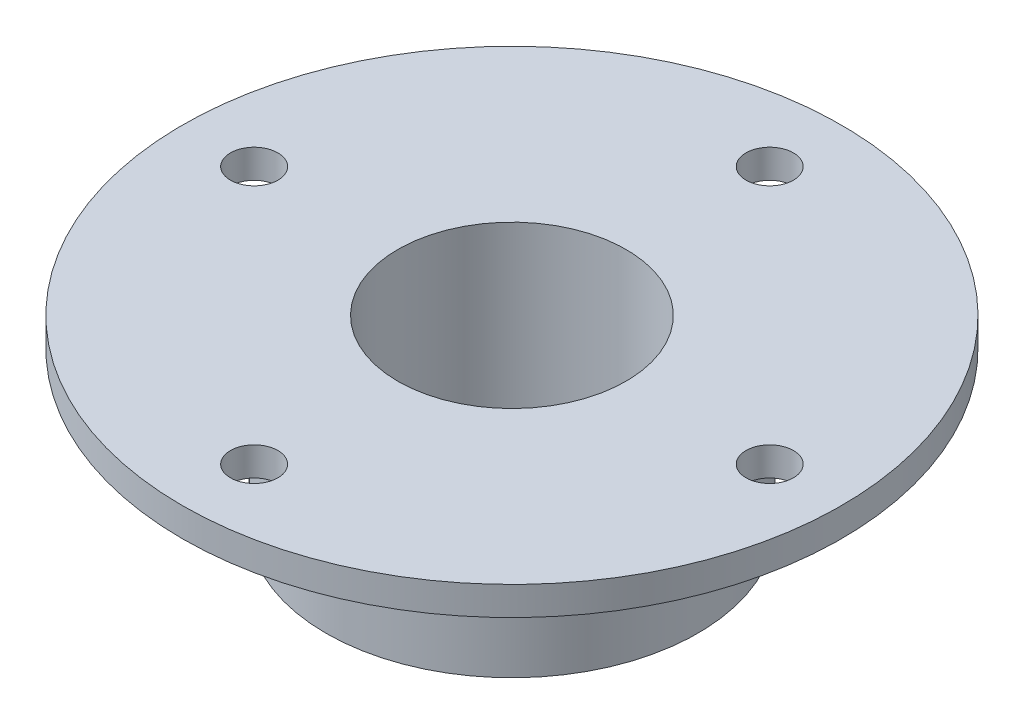
ISO-10303-21;
HEADER;
FILE_DESCRIPTION(('STEP AP214'),'2;1');
FILE_NAME('part.step','',(''),(''),'','','');
FILE_SCHEMA(('AUTOMOTIVE_DESIGN { 1 0 10303 214 1 1 1 1 }'));
ENDSEC;
DATA;
#1=APPLICATION_CONTEXT('core data for automotive mechanical design processes');
#2=APPLICATION_PROTOCOL_DEFINITION('international standard','automotive_design',2000,#1);
#3=PRODUCT_CONTEXT('',#1,'mechanical');
#4=PRODUCT('Part','Part','',(#3));
#5=PRODUCT_RELATED_PRODUCT_CATEGORY('part','',(#4));
#6=PRODUCT_DEFINITION_FORMATION('','',#4);
#7=PRODUCT_DEFINITION_CONTEXT('part definition',#1,'design');
#8=PRODUCT_DEFINITION('design','',#6,#7);
#9=PRODUCT_DEFINITION_SHAPE('','',#8);
#10=(LENGTH_UNIT() NAMED_UNIT(*) SI_UNIT(.MILLI.,.METRE.));
#11=(NAMED_UNIT(*) PLANE_ANGLE_UNIT() SI_UNIT($,.RADIAN.));
#12=(NAMED_UNIT(*) SI_UNIT($,.STERADIAN.) SOLID_ANGLE_UNIT());
#13=UNCERTAINTY_MEASURE_WITH_UNIT(LENGTH_MEASURE(1.E-05),#10,'distance_accuracy_value','');
#14=(GEOMETRIC_REPRESENTATION_CONTEXT(3) GLOBAL_UNCERTAINTY_ASSIGNED_CONTEXT((#13)) GLOBAL_UNIT_ASSIGNED_CONTEXT((#10,
#11,#12)) REPRESENTATION_CONTEXT('',''));
#15=CARTESIAN_POINT('',(0.,0.,0.));
#16=DIRECTION('',(0.,0.,1.));
#17=DIRECTION('',(1.,0.,0.));
#18=AXIS2_PLACEMENT_3D('',#15,#16,#17);
#19=CARTESIAN_POINT('',(0.,15.542380952381,0.));
#20=DIRECTION('',(0.,1.,0.));
#21=DIRECTION('',(0.,0.,1.));
#22=AXIS2_PLACEMENT_3D('',#19,#20,#21);
#23=CYLINDRICAL_SURFACE('',#22,7.95);
#24=CARTESIAN_POINT('',(7.70713954719908,5.04761904761905,1.95));
#25=CARTESIAN_POINT('',(7.70714164004719,5.15536851937687,1.94999682487747));
#26=CARTESIAN_POINT('',(7.70942379614447,5.2631535771368,1.94103885517686));
#27=CARTESIAN_POINT('',(7.71828358138446,5.47563323861813,1.90549790652003));
#28=CARTESIAN_POINT('',(7.72486380550783,5.58032593537258,1.878904279797));
#29=CARTESIAN_POINT('',(7.74153065521619,5.78351675060062,1.80900060115888));
#30=CARTESIAN_POINT('',(7.75161286155814,5.88202249242709,1.76571160999943));
#31=CARTESIAN_POINT('',(7.7741421967269,6.07038283522649,1.66370960518114));
#32=CARTESIAN_POINT('',(7.7865894027847,6.16023715353572,1.60499608779789));
#33=CARTESIAN_POINT('',(7.81274144049453,6.3306481852031,1.47248314334663));
#34=CARTESIAN_POINT('',(7.82646574890276,6.41099458382224,1.39841704439096));
#35=CARTESIAN_POINT('',(7.85345641051113,6.55825793807032,1.23787601132762));
#36=CARTESIAN_POINT('',(7.86672272201744,6.62517367369142,1.15139995115263));
#37=CARTESIAN_POINT('',(7.8915176042208,6.74453217439515,0.967057738776489));
#38=CARTESIAN_POINT('',(7.90302051015251,6.79676901006459,0.86905450024796));
#39=CARTESIAN_POINT('',(7.92277066238978,6.8839490015971,0.665329340335583));
#40=CARTESIAN_POINT('',(7.93101837052726,6.91889461083532,0.559608516409644));
#41=CARTESIAN_POINT('',(7.94319115495325,6.96982844526237,0.345640930447188));
#42=CARTESIAN_POINT('',(7.94719752056992,6.98617364151785,0.237483847699868));
#43=CARTESIAN_POINT('',(7.95071922634913,7.00056248030313,0.01989352136043));
#44=CARTESIAN_POINT('',(7.95023520664685,6.99860873147248,-0.0895395381110666));
#45=CARTESIAN_POINT('',(7.9448914462118,6.97671333302249,-0.304102004411009));
#46=CARTESIAN_POINT('',(7.94012541887512,6.95715690800652,-0.409273406172052));
#47=CARTESIAN_POINT('',(7.92686189147079,6.9012296436276,-0.614793825678697));
#48=CARTESIAN_POINT('',(7.91836419702107,6.86485792835303,-0.715142591911673));
#49=CARTESIAN_POINT('',(7.8984476083154,6.77601631431697,-0.909192721227378));
#50=CARTESIAN_POINT('',(7.8870037283565,6.72340791837586,-1.00282800670514));
#51=CARTESIAN_POINT('',(7.86243831763993,6.6036910580689,-1.18007722392496));
#52=CARTESIAN_POINT('',(7.84931650496705,6.53658015577709,-1.26368946707724));
#53=CARTESIAN_POINT('',(7.82242354605156,6.38769296418567,-1.42081579378603));
#54=CARTESIAN_POINT('',(7.80864438995799,6.30557992712483,-1.49400974934107));
#55=CARTESIAN_POINT('',(7.78230397995903,6.13010066228205,-1.62565833100042));
#56=CARTESIAN_POINT('',(7.76974277871263,6.03673394833177,-1.6841123199882));
#57=CARTESIAN_POINT('',(7.74723288461896,5.84078745330484,-1.78481639560774));
#58=CARTESIAN_POINT('',(7.73729625160693,5.73816795305719,-1.82699207909651));
#59=CARTESIAN_POINT('',(7.72131688022417,5.52699318745641,-1.89339500701495));
#60=CARTESIAN_POINT('',(7.7152733438074,5.41843914357847,-1.91762593009433));
#61=CARTESIAN_POINT('',(7.70793121837334,5.2014386616266,-1.94692593019131));
#62=CARTESIAN_POINT('',(7.70651573337143,5.09305985858957,-1.95246718978838));
#63=CARTESIAN_POINT('',(7.70827223504942,4.87692625558926,-1.9455210017782));
#64=CARTESIAN_POINT('',(7.71144381692082,4.76917140140505,-1.93303514506352));
#65=CARTESIAN_POINT('',(7.72190533265225,4.55908020849763,-1.89080251532189));
#66=CARTESIAN_POINT('',(7.72913019661672,4.45668553892621,-1.86132826781096));
#67=CARTESIAN_POINT('',(7.74682292621297,4.2582898825276,-1.78625654301056));
#68=CARTESIAN_POINT('',(7.75729116482663,4.16228963258989,-1.74065721128196));
#69=CARTESIAN_POINT('',(7.7805389489931,3.9774004431299,-1.6336332310206));
#70=CARTESIAN_POINT('',(7.79335855545137,3.88868085372817,-1.5719249143414));
#71=CARTESIAN_POINT('',(7.81976521049013,3.72268249984598,-1.43479527031224));
#72=CARTESIAN_POINT('',(7.83335238003105,3.6454055456002,-1.35937177740582));
#73=CARTESIAN_POINT('',(7.8601576901204,3.50258610685457,-1.19479049886741));
#74=CARTESIAN_POINT('',(7.87335916302369,3.43736953034433,-1.10534668532517));
#75=CARTESIAN_POINT('',(7.89756747582818,3.32288325095331,-0.916502210133368));
#76=CARTESIAN_POINT('',(7.90857442894425,3.27361272533701,-0.817102062526888));
#77=CARTESIAN_POINT('',(7.92708490870601,3.19283678055048,-0.611846517805765));
#78=CARTESIAN_POINT('',(7.93461320152911,3.16120543516085,-0.506043015856741));
#79=CARTESIAN_POINT('',(7.94542635717703,3.11622486213789,-0.290413900663063));
#80=CARTESIAN_POINT('',(7.94871200633813,3.10287224667689,-0.180589036623562));
#81=CARTESIAN_POINT('',(7.95063895631144,3.0950127490621,0.0368986604380923));
#82=CARTESIAN_POINT('',(7.94939899755022,3.10002405834118,0.144543299034705));
#83=CARTESIAN_POINT('',(7.94267595069296,3.12765070059859,0.357406738076572));
#84=CARTESIAN_POINT('',(7.93719298026476,3.15026554539317,0.462625605710337));
#85=CARTESIAN_POINT('',(7.92261687276079,3.2122029787223,0.667167112733501));
#86=CARTESIAN_POINT('',(7.9135419409755,3.25144138285007,0.766516625765055));
#87=CARTESIAN_POINT('',(7.89273951777148,3.34543516035971,0.957277576622598));
#88=CARTESIAN_POINT('',(7.88101170317443,3.40019242447898,1.04868804542263));
#89=CARTESIAN_POINT('',(7.85583056134089,3.52515513483351,1.22327147151515));
#90=CARTESIAN_POINT('',(7.84234352075143,3.5956894390267,1.30620418284859));
#91=CARTESIAN_POINT('',(7.81532007245404,3.74956153041641,1.45921998155583));
#92=CARTESIAN_POINT('',(7.80178365319767,3.83290252893492,1.52929983633751));
#93=CARTESIAN_POINT('',(7.77592098094009,4.01180591616752,1.65584066591437));
#94=CARTESIAN_POINT('',(7.76362052222614,4.1075592453546,1.71203735912866));
#95=CARTESIAN_POINT('',(7.74196552511209,4.30744115164739,1.80745142488432));
#96=CARTESIAN_POINT('',(7.73260878758571,4.41156340333501,1.84668148071259));
#97=CARTESIAN_POINT('',(7.71940640591023,4.60423036584682,1.90102013621684));
#98=CARTESIAN_POINT('',(7.71484027457414,4.69183157853504,1.91934834737752));
#99=CARTESIAN_POINT('',(7.70870609455477,4.86882013585071,1.94383911915987));
#100=CARTESIAN_POINT('',(7.70713781053048,4.95820733971518,1.95000263475192));
#101=CARTESIAN_POINT('',(7.70713954719908,5.04761904761905,1.95));
#102=B_SPLINE_CURVE_WITH_KNOTS('',3,(#24,#25,#26,#27,#28,#29,#30,#31,#32,#33,#34,#35,#36,#37,
#38,#39,#40,#41,#42,#43,#44,#45,#46,#47,#48,#49,#50,#51,#52,#53,#54,#55,#56,#57,#58,#59,#60,#61,
#62,#63,#64,#65,#66,#67,#68,#69,#70,#71,#72,#73,#74,#75,#76,#77,#78,#79,#80,#81,#82,#83,#84,#85,
#86,#87,#88,#89,#90,#91,#92,#93,#94,#95,#96,#97,#98,#99,#100,#101),.UNSPECIFIED.,.T.,.F.,(4,2,2,
2,2,2,2,2,2,2,2,2,2,2,2,2,2,2,2,2,2,2,2,2,2,2,2,2,2,2,2,2,2,2,2,2,2,2,4),(0.,0.322920178688794,
0.646035502532505,0.968744551244134,1.29146414009399,1.62034642402652,1.94925856929613,
2.28257765643633,2.61584943684358,2.94261123836216,3.26932645846409,3.5890610230098,
3.90881224446554,4.23137003293686,4.55398208682711,4.8850055818676,5.21604338253129,
5.54857682642858,5.88104208257042,6.20504224024471,6.52901380666064,6.84792743985315,
7.16687776112434,7.49187565790376,7.81692491482333,8.14977049562374,8.48259890053802,
8.8130197847565,9.14337941960759,9.46513430840976,9.78688027457747,10.1070159848924,
10.427190715661,10.7547918303852,11.0824752266523,11.415984501409,11.7492440309749,
12.017227818809,12.2851905681585),.UNSPECIFIED.);
#103=CARTESIAN_POINT('',(7.70713954719908,5.04761904761905,1.95));
#104=VERTEX_POINT('',#103);
#105=EDGE_CURVE('E74',#104,#104,#102,.T.);
#106=ORIENTED_EDGE('',*,*,#105,.F.);
#107=EDGE_LOOP('',(#106));
#108=FACE_BOUND('',#107,.T.);
#109=CARTESIAN_POINT('',(0.,12.3976190476191,0.));
#110=DIRECTION('',(0.,1.,0.));
#111=DIRECTION('',(0.,0.,1.));
#112=AXIS2_PLACEMENT_3D('',#109,#110,#111);
#113=CIRCLE('',#112,7.95);
#114=CARTESIAN_POINT('',(0.,12.3976190476191,7.95));
#115=VERTEX_POINT('',#114);
#116=EDGE_CURVE('E11',#115,#115,#113,.T.);
#117=ORIENTED_EDGE('',*,*,#116,.T.);
#118=EDGE_LOOP('',(#117));
#119=FACE_BOUND('',#118,.T.);
#120=CARTESIAN_POINT('',(0.,-0.302380952380945,0.));
#121=DIRECTION('',(0.,1.,0.));
#122=DIRECTION('',(0.,0.,1.));
#123=AXIS2_PLACEMENT_3D('',#120,#121,#122);
#124=CIRCLE('',#123,7.95);
#125=CARTESIAN_POINT('',(0.,-0.302380952380945,7.95));
#126=VERTEX_POINT('',#125);
#127=EDGE_CURVE('E71',#126,#126,#124,.T.);
#128=ORIENTED_EDGE('',*,*,#127,.F.);
#129=EDGE_LOOP('',(#128));
#130=FACE_BOUND('',#129,.T.);
#131=ADVANCED_FACE('F43',(#108,#119,#130),#23,.F.);
#132=CARTESIAN_POINT('',(-7.95,12.397619047619,0.));
#133=DIRECTION('',(0.,1.,0.));
#134=DIRECTION('',(0.,0.,1.));
#135=AXIS2_PLACEMENT_3D('',#132,#133,#134);
#136=PLANE('',#135);
#137=CARTESIAN_POINT('',(0.,12.397619047619,17.95));
#138=DIRECTION('',(0.,1.,0.));
#139=DIRECTION('',(0.,0.,1.));
#140=AXIS2_PLACEMENT_3D('',#137,#138,#139);
#141=CIRCLE('',#140,1.65);
#142=CARTESIAN_POINT('',(0.,12.397619047619,19.6));
#143=VERTEX_POINT('',#142);
#144=EDGE_CURVE('E116',#143,#143,#141,.F.);
#145=ORIENTED_EDGE('',*,*,#144,.T.);
#146=EDGE_LOOP('',(#145));
#147=FACE_BOUND('',#146,.T.);
#148=CARTESIAN_POINT('',(17.95,12.397619047619,0.));
#149=DIRECTION('',(0.,1.,0.));
#150=DIRECTION('',(0.,0.,1.));
#151=AXIS2_PLACEMENT_3D('',#148,#149,#150);
#152=CIRCLE('',#151,1.65);
#153=CARTESIAN_POINT('',(17.95,12.397619047619,1.64999999999994));
#154=VERTEX_POINT('',#153);
#155=EDGE_CURVE('E120',#154,#154,#152,.F.);
#156=ORIENTED_EDGE('',*,*,#155,.T.);
#157=EDGE_LOOP('',(#156));
#158=FACE_BOUND('',#157,.T.);
#159=CARTESIAN_POINT('',(-1.26138224658009E-13,12.397619047619,-17.95));
#160=DIRECTION('',(0.,1.,0.));
#161=DIRECTION('',(0.,0.,1.));
#162=AXIS2_PLACEMENT_3D('',#159,#160,#161);
#163=CIRCLE('',#162,1.65);
#164=CARTESIAN_POINT('',(-1.26138224658009E-13,12.397619047619,-16.3));
#165=VERTEX_POINT('',#164);
#166=EDGE_CURVE('E124',#165,#165,#163,.F.);
#167=ORIENTED_EDGE('',*,*,#166,.T.);
#168=EDGE_LOOP('',(#167));
#169=FACE_BOUND('',#168,.T.);
#170=CARTESIAN_POINT('',(-17.95,12.397619047619,1.88810314690243E-13));
#171=DIRECTION('',(0.,1.,0.));
#172=DIRECTION('',(0.,0.,1.));
#173=AXIS2_PLACEMENT_3D('',#170,#171,#172);
#174=CIRCLE('',#173,1.65);
#175=CARTESIAN_POINT('',(-17.95,12.397619047619,1.65000000000019));
#176=VERTEX_POINT('',#175);
#177=EDGE_CURVE('E128',#176,#176,#174,.F.);
#178=ORIENTED_EDGE('',*,*,#177,.T.);
#179=EDGE_LOOP('',(#178));
#180=FACE_BOUND('',#179,.T.);
#181=CARTESIAN_POINT('',(0.,12.397619047619,0.));
#182=DIRECTION('',(0.,1.,0.));
#183=DIRECTION('',(0.,0.,1.));
#184=AXIS2_PLACEMENT_3D('',#181,#182,#183);
#185=CIRCLE('',#184,22.95);
#186=CARTESIAN_POINT('',(0.,12.397619047619,22.95));
#187=VERTEX_POINT('',#186);
#188=EDGE_CURVE('E56',#187,#187,#185,.T.);
#189=ORIENTED_EDGE('',*,*,#188,.T.);
#190=EDGE_LOOP('',(#189));
#191=FACE_BOUND('',#190,.T.);
#192=ORIENTED_EDGE('',*,*,#116,.F.);
#193=EDGE_LOOP('',(#192));
#194=FACE_BOUND('',#193,.T.);
#195=ADVANCED_FACE('F105',(#147,#158,#169,#180,#191,#194),#136,.T.);
#196=CARTESIAN_POINT('',(0.,15.542380952381,0.));
#197=DIRECTION('',(0.,1.,0.));
#198=DIRECTION('',(0.,0.,1.));
#199=AXIS2_PLACEMENT_3D('',#196,#197,#198);
#200=CYLINDRICAL_SURFACE('',#199,22.95);
#201=CARTESIAN_POINT('',(0.,10.397619047619,0.));
#202=DIRECTION('',(0.,1.,0.));
#203=DIRECTION('',(0.,0.,1.));
#204=AXIS2_PLACEMENT_3D('',#201,#202,#203);
#205=CIRCLE('',#204,22.95);
#206=CARTESIAN_POINT('',(0.,10.397619047619,22.95));
#207=VERTEX_POINT('',#206);
#208=EDGE_CURVE('E60',#207,#207,#205,.T.);
#209=ORIENTED_EDGE('',*,*,#208,.T.);
#210=EDGE_LOOP('',(#209));
#211=FACE_BOUND('',#210,.T.);
#212=ORIENTED_EDGE('',*,*,#188,.F.);
#213=EDGE_LOOP('',(#212));
#214=FACE_BOUND('',#213,.T.);
#215=ADVANCED_FACE('F102',(#211,#214),#200,.T.);
#216=CARTESIAN_POINT('',(-22.95,10.397619047619,0.));
#217=DIRECTION('',(0.,-1.,0.));
#218=DIRECTION('',(0.,0.,-1.));
#219=AXIS2_PLACEMENT_3D('',#216,#217,#218);
#220=PLANE('',#219);
#221=CARTESIAN_POINT('',(0.,10.397619047619,17.95));
#222=DIRECTION('',(0.,-1.,0.));
#223=DIRECTION('',(0.,0.,-1.));
#224=AXIS2_PLACEMENT_3D('',#221,#222,#223);
#225=CIRCLE('',#224,1.65);
#226=CARTESIAN_POINT('',(0.,10.397619047619,16.3));
#227=VERTEX_POINT('',#226);
#228=EDGE_CURVE('E142',#227,#227,#225,.T.);
#229=ORIENTED_EDGE('',*,*,#228,.F.);
#230=EDGE_LOOP('',(#229));
#231=FACE_BOUND('',#230,.T.);
#232=CARTESIAN_POINT('',(17.95,10.397619047619,0.));
#233=DIRECTION('',(0.,-1.,0.));
#234=DIRECTION('',(0.,0.,-1.));
#235=AXIS2_PLACEMENT_3D('',#232,#233,#234);
#236=CIRCLE('',#235,1.65);
#237=CARTESIAN_POINT('',(17.95,10.397619047619,-1.65000000000006));
#238=VERTEX_POINT('',#237);
#239=EDGE_CURVE('E139',#238,#238,#236,.T.);
#240=ORIENTED_EDGE('',*,*,#239,.F.);
#241=EDGE_LOOP('',(#240));
#242=FACE_BOUND('',#241,.T.);
#243=CARTESIAN_POINT('',(-1.26138224658009E-13,10.397619047619,-17.95));
#244=DIRECTION('',(0.,-1.,0.));
#245=DIRECTION('',(0.,0.,-1.));
#246=AXIS2_PLACEMENT_3D('',#243,#244,#245);
#247=CIRCLE('',#246,1.65);
#248=CARTESIAN_POINT('',(-1.26138224658009E-13,10.397619047619,-19.6));
#249=VERTEX_POINT('',#248);
#250=EDGE_CURVE('E135',#249,#249,#247,.T.);
#251=ORIENTED_EDGE('',*,*,#250,.F.);
#252=EDGE_LOOP('',(#251));
#253=FACE_BOUND('',#252,.T.);
#254=CARTESIAN_POINT('',(-17.95,10.397619047619,1.88810314690243E-13));
#255=DIRECTION('',(0.,-1.,0.));
#256=DIRECTION('',(0.,0.,-1.));
#257=AXIS2_PLACEMENT_3D('',#254,#255,#256);
#258=CIRCLE('',#257,1.65);
#259=CARTESIAN_POINT('',(-17.95,10.397619047619,-1.64999999999981));
#260=VERTEX_POINT('',#259);
#261=EDGE_CURVE('E80',#260,#260,#258,.T.);
#262=ORIENTED_EDGE('',*,*,#261,.F.);
#263=EDGE_LOOP('',(#262));
#264=FACE_BOUND('',#263,.T.);
#265=CARTESIAN_POINT('',(0.,10.397619047619,0.));
#266=DIRECTION('',(0.,1.,0.));
#267=DIRECTION('',(0.,0.,1.));
#268=AXIS2_PLACEMENT_3D('',#265,#266,#267);
#269=CIRCLE('',#268,12.95);
#270=CARTESIAN_POINT('',(0.,10.397619047619,12.95));
#271=VERTEX_POINT('',#270);
#272=EDGE_CURVE('E65',#271,#271,#269,.T.);
#273=ORIENTED_EDGE('',*,*,#272,.T.);
#274=EDGE_LOOP('',(#273));
#275=FACE_BOUND('',#274,.T.);
#276=ORIENTED_EDGE('',*,*,#208,.F.);
#277=EDGE_LOOP('',(#276));
#278=FACE_BOUND('',#277,.T.);
#279=ADVANCED_FACE('F98',(#231,#242,#253,#264,#275,#278),#220,.T.);
#280=CARTESIAN_POINT('',(0.,15.542380952381,0.));
#281=DIRECTION('',(0.,1.,0.));
#282=DIRECTION('',(0.,0.,1.));
#283=AXIS2_PLACEMENT_3D('',#280,#281,#282);
#284=CYLINDRICAL_SURFACE('',#283,12.95);
#285=CARTESIAN_POINT('',(12.8023435354626,5.04761904761905,1.95));
#286=CARTESIAN_POINT('',(12.8023453606191,4.93875495437094,1.94999550732128));
#287=CARTESIAN_POINT('',(12.8037471418825,4.82982779145566,1.94085271641215));
#288=CARTESIAN_POINT('',(12.809198967102,4.61501931283433,1.9045330370261));
#289=CARTESIAN_POINT('',(12.8132515894375,4.50914106749136,1.87733858995845));
#290=CARTESIAN_POINT('',(12.8235359144887,4.30357080141327,1.805747954121));
#291=CARTESIAN_POINT('',(12.8297659396038,4.20387408748623,1.76136500555719));
#292=CARTESIAN_POINT('',(12.8437011120444,4.01335696666096,1.65668846872511));
#293=CARTESIAN_POINT('',(12.8514060574805,3.92253534749197,1.5963970576069));
#294=CARTESIAN_POINT('',(12.8674924132693,3.75159987881576,1.46109562439119));
#295=CARTESIAN_POINT('',(12.8758783029493,3.67156800781375,1.38598255283833));
#296=CARTESIAN_POINT('',(12.8923416945767,3.52519430961463,1.22339249983901));
#297=CARTESIAN_POINT('',(12.900419179505,3.45885323704579,1.13591483731152));
#298=CARTESIAN_POINT('',(12.9154025258614,3.34144168425013,0.950553410395715));
#299=CARTESIAN_POINT('',(12.922302523331,3.29044671972583,0.852621298480731));
#300=CARTESIAN_POINT('',(12.934103833272,3.20565958102329,0.649460698641122));
#301=CARTESIAN_POINT('',(12.9390052521468,3.17186649100231,0.544232599500186));
#302=CARTESIAN_POINT('',(12.9462255472521,3.12269094252595,0.330311397320942));
#303=CARTESIAN_POINT('',(12.9485636724466,3.1071711948768,0.221650514107009));
#304=CARTESIAN_POINT('',(12.9504599137318,3.09455656685826,0.00324342322764746));
#305=CARTESIAN_POINT('',(12.9500181855041,3.09746065468995,-0.106502723315574));
#306=CARTESIAN_POINT('',(12.9464198662949,3.12150295980381,-0.323028313169613));
#307=CARTESIAN_POINT('',(12.9432852674048,3.14249347330388,-0.429824574407256));
#308=CARTESIAN_POINT('',(12.9346779166849,3.20188091401599,-0.638361478990715));
#309=CARTESIAN_POINT('',(12.9292051042978,3.24027829204782,-0.740101991322135));
#310=CARTESIAN_POINT('',(12.9164984747438,3.33354056508449,-0.936086161723861));
#311=CARTESIAN_POINT('',(12.9092580325967,3.38846759687125,-1.03029980397917));
#312=CARTESIAN_POINT('',(12.8938229988492,3.51318462823834,-1.20822857206081));
#313=CARTESIAN_POINT('',(12.8856283439793,3.58297561363434,-1.29194300096688));
#314=CARTESIAN_POINT('',(12.8691028252707,3.73626214080885,-1.44736772413165));
#315=CARTESIAN_POINT('',(12.8607714163899,3.81988664416083,-1.51895083214433));
#316=CARTESIAN_POINT('',(12.8449905906029,3.9980283842107,-1.64708764663609));
#317=CARTESIAN_POINT('',(12.8375411792083,4.09254568896947,-1.70364125919991));
#318=CARTESIAN_POINT('',(12.8243679214423,4.2899231061834,-1.80013118352454));
#319=CARTESIAN_POINT('',(12.8186454414261,4.39278974344011,-1.84005434665322));
#320=CARTESIAN_POINT('',(12.8095980918154,4.60387355816772,-1.90202173796625));
#321=CARTESIAN_POINT('',(12.8062730518732,4.71209035490446,-1.92406723644388));
#322=CARTESIAN_POINT('',(12.8024293782351,4.92967080315846,-1.94947891822121));
#323=CARTESIAN_POINT('',(12.8018836528976,5.03901293167252,-1.95302543046878));
#324=CARTESIAN_POINT('',(12.8035884620732,5.25673003186499,-1.94181703076473));
#325=CARTESIAN_POINT('',(12.8058389091261,5.36510503368694,-1.92706269123738));
#326=CARTESIAN_POINT('',(12.8128576019823,5.57725237102804,-1.87982437882682));
#327=CARTESIAN_POINT('',(12.8176130761871,5.6810451852436,-1.84743031209987));
#328=CARTESIAN_POINT('',(12.8290954602804,5.88172782975145,-1.76592564316439));
#329=CARTESIAN_POINT('',(12.8358224682198,5.97861731642084,-1.7168142095273));
#330=CARTESIAN_POINT('',(12.850553749886,6.16355113723315,-1.60283588996441));
#331=CARTESIAN_POINT('',(12.8585673257207,6.25152279726599,-1.53785231080184));
#332=CARTESIAN_POINT('',(12.8749408226687,6.41537655448841,-1.39413649918323));
#333=CARTESIAN_POINT('',(12.8833007635022,6.49125796213432,-1.3154034830916));
#334=CARTESIAN_POINT('',(12.8995097374399,6.62942520320256,-1.14562941888075));
#335=CARTESIAN_POINT('',(12.907353890136,6.69159150459173,-1.05449055714997));
#336=CARTESIAN_POINT('',(12.9215715374896,6.79973091548236,-0.862958596977424));
#337=CARTESIAN_POINT('',(12.9279450726316,6.84570447077305,-0.762565753395471));
#338=CARTESIAN_POINT('',(12.9384819808059,6.91996254579462,-0.555748210231557));
#339=CARTESIAN_POINT('',(12.9426534994154,6.9483123285774,-0.44934737596397));
#340=CARTESIAN_POINT('',(12.9483505571914,6.98672928477568,-0.233227852496311));
#341=CARTESIAN_POINT('',(12.9498762725244,6.99679767543036,-0.1235093846905));
#342=CARTESIAN_POINT('',(12.9501080273827,6.99833615694086,0.0949717527043761));
#343=CARTESIAN_POINT('',(12.9488417902727,6.98998910785759,0.203733149434433));
#344=CARTESIAN_POINT('',(12.9436878439656,6.95532572160826,0.418287059691632));
#345=CARTESIAN_POINT('',(12.9398001433481,6.9290094432522,0.524079582934177));
#346=CARTESIAN_POINT('',(12.9298380962061,6.85921966990813,0.729641816086225));
#347=CARTESIAN_POINT('',(12.9237653759115,6.81575893259999,0.829415940953877));
#348=CARTESIAN_POINT('',(12.9101001593361,6.71293347106799,1.02028444343754));
#349=CARTESIAN_POINT('',(12.9025076129497,6.65356822248354,1.11137853474467));
#350=CARTESIAN_POINT('',(12.8865570950754,6.51995814340986,1.28322839915613));
#351=CARTESIAN_POINT('',(12.8781925835502,6.44557833843393,1.36387863476326));
#352=CARTESIAN_POINT('',(12.8616891340737,6.28433446722608,1.51161943867854));
#353=CARTESIAN_POINT('',(12.8535502495198,6.19746747533195,1.57870682041435));
#354=CARTESIAN_POINT('',(12.8383701003476,6.01313617733255,1.69775910804346));
#355=CARTESIAN_POINT('',(12.8313353158608,5.91561461776616,1.74963617985));
#356=CARTESIAN_POINT('',(12.8192358767894,5.71318224307603,1.83619671526911));
#357=CARTESIAN_POINT('',(12.8141691813668,5.60827921636121,1.87089799985666));
#358=CARTESIAN_POINT('',(12.8077486086242,5.42702583530372,1.91425783813944));
#359=CARTESIAN_POINT('',(12.8057324705358,5.35179423163054,1.92764060726058));
#360=CARTESIAN_POINT('',(12.8030293027748,5.20025842843458,1.94551320499203));
#361=CARTESIAN_POINT('',(12.8023422556679,5.12395424299457,1.95000315025365));
#362=CARTESIAN_POINT('',(12.8023435354626,5.04761904761905,1.95));
#363=B_SPLINE_CURVE_WITH_KNOTS('',3,(#285,#286,#287,#288,#289,#290,#291,#292,#293,#294,#295,
#296,#297,#298,#299,#300,#301,#302,#303,#304,#305,#306,#307,#308,#309,#310,#311,#312,#313,#314,
#315,#316,#317,#318,#319,#320,#321,#322,#323,#324,#325,#326,#327,#328,#329,#330,#331,#332,#333,
#334,#335,#336,#337,#338,#339,#340,#341,#342,#343,#344,#345,#346,#347,#348,#349,#350,#351,#352,
#353,#354,#355,#356,#357,#358,#359,#360,#361,#362),.UNSPECIFIED.,.T.,.F.,(4,2,2,2,2,2,2,2,2,2,2,
2,2,2,2,2,2,2,2,2,2,2,2,2,2,2,2,2,2,2,2,2,2,2,2,2,2,2,4),(0.,0.326313261358167,
0.652944389021464,0.979324413402594,1.30565979424481,1.63434952510275,1.96305736829787,
2.29335723069005,2.62363950579099,2.95142417863967,3.27919049456767,3.60430518803117,
3.92942830210991,4.2557891889803,4.58217172768915,4.91178880900458,5.24140794995985,
5.57128720729546,5.90114302308345,6.22777729815077,6.55440135682604,6.87937605105162,
7.20436691006749,7.53182311966263,7.85929799839586,8.18952311594331,8.51973914162275,
8.84872493544844,9.1776888234434,9.50340090908563,9.8291119287367,10.1545810333631,
10.4800608697984,10.8086085400643,11.1372333126366,11.4677199985823,11.7978630609166,
12.0266760016029,12.2554859408235),.UNSPECIFIED.);
#364=CARTESIAN_POINT('',(12.8023435354626,5.04761904761905,1.95));
#365=VERTEX_POINT('',#364);
#366=EDGE_CURVE('E47',#365,#365,#363,.T.);
#367=ORIENTED_EDGE('',*,*,#366,.F.);
#368=EDGE_LOOP('',(#367));
#369=FACE_BOUND('',#368,.T.);
#370=CARTESIAN_POINT('',(0.,-0.302380952380948,0.));
#371=DIRECTION('',(0.,1.,0.));
#372=DIRECTION('',(0.,0.,1.));
#373=AXIS2_PLACEMENT_3D('',#370,#371,#372);
#374=CIRCLE('',#373,12.95);
#375=CARTESIAN_POINT('',(0.,-0.302380952380948,12.95));
#376=VERTEX_POINT('',#375);
#377=EDGE_CURVE('E68',#376,#376,#374,.T.);
#378=ORIENTED_EDGE('',*,*,#377,.T.);
#379=EDGE_LOOP('',(#378));
#380=FACE_BOUND('',#379,.T.);
#381=ORIENTED_EDGE('',*,*,#272,.F.);
#382=EDGE_LOOP('',(#381));
#383=FACE_BOUND('',#382,.T.);
#384=ADVANCED_FACE('F93',(#369,#380,#383),#284,.T.);
#385=CARTESIAN_POINT('',(-12.95,-0.302380952380947,0.));
#386=DIRECTION('',(0.,-1.,0.));
#387=DIRECTION('',(0.,0.,-1.));
#388=AXIS2_PLACEMENT_3D('',#385,#386,#387);
#389=PLANE('',#388);
#390=ORIENTED_EDGE('',*,*,#127,.T.);
#391=EDGE_LOOP('',(#390));
#392=FACE_BOUND('',#391,.T.);
#393=ORIENTED_EDGE('',*,*,#377,.F.);
#394=EDGE_LOOP('',(#393));
#395=FACE_BOUND('',#394,.T.);
#396=ADVANCED_FACE('F88',(#392,#395),#389,.T.);
#397=CARTESIAN_POINT('',(0.,5.04761904761905,0.));
#398=DIRECTION('',(-1.,0.,0.));
#399=DIRECTION('',(0.,0.,1.));
#400=AXIS2_PLACEMENT_3D('',#397,#398,#399);
#401=CYLINDRICAL_SURFACE('',#400,1.95);
#402=ORIENTED_EDGE('',*,*,#105,.T.);
#403=EDGE_LOOP('',(#402));
#404=FACE_BOUND('',#403,.T.);
#405=ORIENTED_EDGE('',*,*,#366,.T.);
#406=EDGE_LOOP('',(#405));
#407=FACE_BOUND('',#406,.T.);
#408=ADVANCED_FACE('F82',(#404,#407),#401,.F.);
#409=CARTESIAN_POINT('',(-17.95,17.0645238034503,1.88810314690243E-13));
#410=DIRECTION('',(0.,-1.,0.));
#411=DIRECTION('',(0.,0.,-1.));
#412=AXIS2_PLACEMENT_3D('',#409,#410,#411);
#413=CYLINDRICAL_SURFACE('',#412,1.65);
#414=ORIENTED_EDGE('',*,*,#261,.T.);
#415=EDGE_LOOP('',(#414));
#416=FACE_BOUND('',#415,.T.);
#417=ORIENTED_EDGE('',*,*,#177,.F.);
#418=EDGE_LOOP('',(#417));
#419=FACE_BOUND('',#418,.T.);
#420=ADVANCED_FACE('F87',(#416,#419),#413,.F.);
#421=CARTESIAN_POINT('',(-1.26138224658009E-13,17.0645238034503,-17.95));
#422=DIRECTION('',(0.,-1.,0.));
#423=DIRECTION('',(0.,0.,-1.));
#424=AXIS2_PLACEMENT_3D('',#421,#422,#423);
#425=CYLINDRICAL_SURFACE('',#424,1.65);
#426=ORIENTED_EDGE('',*,*,#250,.T.);
#427=EDGE_LOOP('',(#426));
#428=FACE_BOUND('',#427,.T.);
#429=ORIENTED_EDGE('',*,*,#166,.F.);
#430=EDGE_LOOP('',(#429));
#431=FACE_BOUND('',#430,.T.);
#432=ADVANCED_FACE('F163',(#428,#431),#425,.F.);
#433=CARTESIAN_POINT('',(17.95,17.0645238034503,0.));
#434=DIRECTION('',(0.,-1.,0.));
#435=DIRECTION('',(0.,0.,-1.));
#436=AXIS2_PLACEMENT_3D('',#433,#434,#435);
#437=CYLINDRICAL_SURFACE('',#436,1.65);
#438=ORIENTED_EDGE('',*,*,#239,.T.);
#439=EDGE_LOOP('',(#438));
#440=FACE_BOUND('',#439,.T.);
#441=ORIENTED_EDGE('',*,*,#155,.F.);
#442=EDGE_LOOP('',(#441));
#443=FACE_BOUND('',#442,.T.);
#444=ADVANCED_FACE('F167',(#440,#443),#437,.F.);
#445=CARTESIAN_POINT('',(0.,17.0645238034503,17.95));
#446=DIRECTION('',(0.,-1.,0.));
#447=DIRECTION('',(0.,0.,-1.));
#448=AXIS2_PLACEMENT_3D('',#445,#446,#447);
#449=CYLINDRICAL_SURFACE('',#448,1.65);
#450=ORIENTED_EDGE('',*,*,#228,.T.);
#451=EDGE_LOOP('',(#450));
#452=FACE_BOUND('',#451,.T.);
#453=ORIENTED_EDGE('',*,*,#144,.F.);
#454=EDGE_LOOP('',(#453));
#455=FACE_BOUND('',#454,.T.);
#456=ADVANCED_FACE('F148',(#452,#455),#449,.F.);
#457=CLOSED_SHELL('',(#131,#195,#215,#279,#384,#396,#408,#420,#432,#444,#456));
#458=MANIFOLD_SOLID_BREP('B2',#457);
#459=ADVANCED_BREP_SHAPE_REPRESENTATION('',(#18,#458),#14);
#460=SHAPE_DEFINITION_REPRESENTATION(#9,#459);
ENDSEC;
END-ISO-10303-21;
